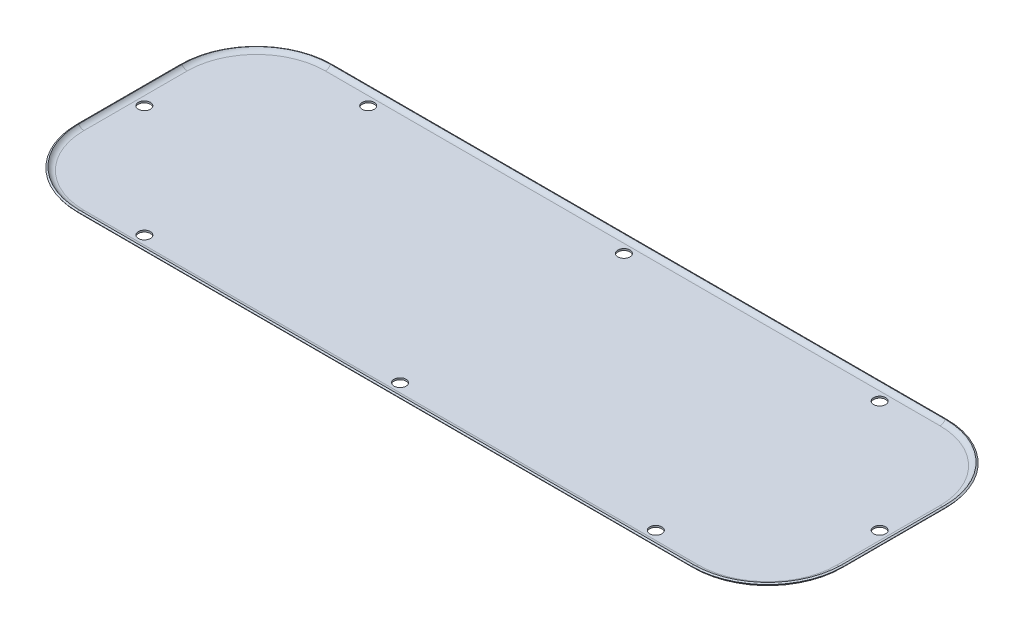
ISO-10303-21;
HEADER;
FILE_DESCRIPTION(('STEP AP214'),'2;1');
FILE_NAME('part.step','',(''),(''),'','','');
FILE_SCHEMA(('AUTOMOTIVE_DESIGN { 1 0 10303 214 1 1 1 1 }'));
ENDSEC;
DATA;
#1=APPLICATION_CONTEXT('core data for automotive mechanical design processes');
#2=APPLICATION_PROTOCOL_DEFINITION('international standard','automotive_design',2000,#1);
#3=PRODUCT_CONTEXT('',#1,'mechanical');
#4=PRODUCT('Part','Part','',(#3));
#5=PRODUCT_RELATED_PRODUCT_CATEGORY('part','',(#4));
#6=PRODUCT_DEFINITION_FORMATION('','',#4);
#7=PRODUCT_DEFINITION_CONTEXT('part definition',#1,'design');
#8=PRODUCT_DEFINITION('design','',#6,#7);
#9=PRODUCT_DEFINITION_SHAPE('','',#8);
#10=(LENGTH_UNIT() NAMED_UNIT(*) SI_UNIT(.MILLI.,.METRE.));
#11=(NAMED_UNIT(*) PLANE_ANGLE_UNIT() SI_UNIT($,.RADIAN.));
#12=(NAMED_UNIT(*) SI_UNIT($,.STERADIAN.) SOLID_ANGLE_UNIT());
#13=UNCERTAINTY_MEASURE_WITH_UNIT(LENGTH_MEASURE(1.E-05),#10,'distance_accuracy_value','');
#14=(GEOMETRIC_REPRESENTATION_CONTEXT(3) GLOBAL_UNCERTAINTY_ASSIGNED_CONTEXT((#13)) GLOBAL_UNIT_ASSIGNED_CONTEXT((#10,
#11,#12)) REPRESENTATION_CONTEXT('',''));
#15=CARTESIAN_POINT('',(0.,0.,0.));
#16=DIRECTION('',(0.,0.,1.));
#17=DIRECTION('',(1.,0.,0.));
#18=AXIS2_PLACEMENT_3D('',#15,#16,#17);
#19=CARTESIAN_POINT('',(-178.5,-396.5,119.));
#20=DIRECTION('',(0.,1.,0.));
#21=DIRECTION('',(1.,0.,0.));
#22=AXIS2_PLACEMENT_3D('',#19,#20,#21);
#23=TOROIDAL_SURFACE('',#22,40.07444271469,4.5);
#24=CARTESIAN_POINT('',(-178.5,-398.700000000004,119.));
#25=DIRECTION('',(0.,-1.,0.));
#26=DIRECTION('',(1.,0.,0.));
#27=AXIS2_PLACEMENT_3D('',#24,#25,#26);
#28=CIRCLE('',#27,43.999999999993);
#29=CARTESIAN_POINT('',(-222.499999999992,-398.699999999999,119.));
#30=VERTEX_POINT('',#29);
#31=CARTESIAN_POINT('',(-178.5,-398.700000000002,162.999999999996));
#32=VERTEX_POINT('',#31);
#33=EDGE_CURVE('E150',#30,#32,#28,.F.);
#34=ORIENTED_EDGE('',*,*,#33,.F.);
#35=CARTESIAN_POINT('',(-218.5744427147,-396.5,119.));
#36=DIRECTION('',(0.,0.,-1.));
#37=DIRECTION('',(-1.,0.,0.));
#38=AXIS2_PLACEMENT_3D('',#35,#36,#37);
#39=CIRCLE('',#38,4.5);
#40=CARTESIAN_POINT('',(-218.574442714699,-401.,119.));
#41=VERTEX_POINT('',#40);
#42=EDGE_CURVE('E130',#41,#30,#39,.T.);
#43=ORIENTED_EDGE('',*,*,#42,.F.);
#44=CARTESIAN_POINT('',(-178.5,-401.,119.));
#45=DIRECTION('',(0.,1.,0.));
#46=DIRECTION('',(-1.,0.,0.));
#47=AXIS2_PLACEMENT_3D('',#44,#45,#46);
#48=CIRCLE('',#47,40.074442714695);
#49=CARTESIAN_POINT('',(-178.5,-401.,159.074442714714));
#50=VERTEX_POINT('',#49);
#51=EDGE_CURVE('E270',#50,#41,#48,.F.);
#52=ORIENTED_EDGE('',*,*,#51,.F.);
#53=CARTESIAN_POINT('',(-178.5,-396.5,159.07444271472));
#54=DIRECTION('',(-1.,0.,0.));
#55=DIRECTION('',(0.,0.,1.));
#56=AXIS2_PLACEMENT_3D('',#53,#54,#55);
#57=CIRCLE('',#56,4.5);
#58=EDGE_CURVE('E153',#32,#50,#57,.F.);
#59=ORIENTED_EDGE('',*,*,#58,.F.);
#60=EDGE_LOOP('',(#34,#43,#52,#59));
#61=FACE_BOUND('',#60,.T.);
#62=ADVANCED_FACE('F16',(#61),#23,.T.);
#63=CARTESIAN_POINT('',(-218.5744427147,-396.5,57.8));
#64=DIRECTION('',(0.,0.,-1.));
#65=DIRECTION('',(-1.,0.,0.));
#66=AXIS2_PLACEMENT_3D('',#63,#64,#65);
#67=CYLINDRICAL_SURFACE('',#66,4.5);
#68=DIRECTION('',(0.,0.,1.));
#69=VECTOR('',#68,1.);
#70=CARTESIAN_POINT('',(-222.499999999993,-398.700000000004,89.));
#71=LINE('',#70,#69);
#72=CARTESIAN_POINT('',(-222.499999999996,-398.700000000003,59.));
#73=VERTEX_POINT('',#72);
#74=EDGE_CURVE('E134',#30,#73,#71,.F.);
#75=ORIENTED_EDGE('',*,*,#74,.T.);
#76=CARTESIAN_POINT('',(-218.57444271472,-396.5,59.));
#77=DIRECTION('',(0.,0.,1.));
#78=DIRECTION('',(-1.,0.,0.));
#79=AXIS2_PLACEMENT_3D('',#76,#77,#78);
#80=CIRCLE('',#79,4.5);
#81=CARTESIAN_POINT('',(-218.57444271471,-401.,59.));
#82=VERTEX_POINT('',#81);
#83=EDGE_CURVE('E140',#82,#73,#80,.F.);
#84=ORIENTED_EDGE('',*,*,#83,.F.);
#85=DIRECTION('',(0.,0.,-1.));
#86=VECTOR('',#85,1.);
#87=CARTESIAN_POINT('',(-218.5744427147,-401.,89.));
#88=LINE('',#87,#86);
#89=EDGE_CURVE('E136',#41,#82,#88,.T.);
#90=ORIENTED_EDGE('',*,*,#89,.F.);
#91=ORIENTED_EDGE('',*,*,#42,.T.);
#92=EDGE_LOOP('',(#75,#84,#90,#91));
#93=FACE_BOUND('',#92,.T.);
#94=ADVANCED_FACE('F132',(#93),#67,.T.);
#95=CARTESIAN_POINT('',(-178.5,-396.5,59.));
#96=DIRECTION('',(0.,1.,0.));
#97=DIRECTION('',(0.,0.,1.));
#98=AXIS2_PLACEMENT_3D('',#95,#96,#97);
#99=TOROIDAL_SURFACE('',#98,40.07444271472,4.5);
#100=CARTESIAN_POINT('',(-178.5,-398.700000000002,59.));
#101=DIRECTION('',(0.,-1.,0.));
#102=DIRECTION('',(0.,0.,1.));
#103=AXIS2_PLACEMENT_3D('',#100,#101,#102);
#104=CIRCLE('',#103,43.9999999999985);
#105=CARTESIAN_POINT('',(-178.5,-398.700000000001,15.0000000000013));
#106=VERTEX_POINT('',#105);
#107=EDGE_CURVE('E164',#106,#73,#104,.F.);
#108=ORIENTED_EDGE('',*,*,#107,.F.);
#109=CARTESIAN_POINT('',(-178.5,-396.5,18.92555728528));
#110=DIRECTION('',(1.,0.,0.));
#111=DIRECTION('',(0.,0.,-1.));
#112=AXIS2_PLACEMENT_3D('',#109,#110,#111);
#113=CIRCLE('',#112,4.5);
#114=CARTESIAN_POINT('',(-178.5,-401.,18.92555728528));
#115=VERTEX_POINT('',#114);
#116=EDGE_CURVE('E240',#115,#106,#113,.T.);
#117=ORIENTED_EDGE('',*,*,#116,.F.);
#118=CARTESIAN_POINT('',(-178.5,-401.,59.));
#119=DIRECTION('',(0.,1.,0.));
#120=DIRECTION('',(0.,0.,-1.));
#121=AXIS2_PLACEMENT_3D('',#118,#119,#120);
#122=CIRCLE('',#121,40.07444271472);
#123=EDGE_CURVE('E508',#82,#115,#122,.F.);
#124=ORIENTED_EDGE('',*,*,#123,.F.);
#125=ORIENTED_EDGE('',*,*,#83,.T.);
#126=EDGE_LOOP('',(#108,#117,#124,#125));
#127=FACE_BOUND('',#126,.T.);
#128=ADVANCED_FACE('F250',(#127),#99,.T.);
#129=CARTESIAN_POINT('',(185.64,-396.5,18.92555728528));
#130=DIRECTION('',(1.,0.,0.));
#131=DIRECTION('',(0.,0.,-1.));
#132=AXIS2_PLACEMENT_3D('',#129,#130,#131);
#133=CYLINDRICAL_SURFACE('',#132,4.5);
#134=DIRECTION('',(1.,0.,0.));
#135=VECTOR('',#134,1.);
#136=CARTESIAN_POINT('',(0.,-398.700000000002,15.0000000000014));
#137=LINE('',#136,#135);
#138=CARTESIAN_POINT('',(178.5,-398.699999999999,15.0000000000101));
#139=VERTEX_POINT('',#138);
#140=EDGE_CURVE('E300',#106,#139,#137,.T.);
#141=ORIENTED_EDGE('',*,*,#140,.T.);
#142=CARTESIAN_POINT('',(178.5,-396.5,18.92555728531));
#143=DIRECTION('',(-1.,0.,0.));
#144=DIRECTION('',(0.,0.,-1.));
#145=AXIS2_PLACEMENT_3D('',#142,#143,#144);
#146=CIRCLE('',#145,4.5);
#147=CARTESIAN_POINT('',(178.5,-401.,18.9255572852925));
#148=VERTEX_POINT('',#147);
#149=EDGE_CURVE('E217',#148,#139,#146,.F.);
#150=ORIENTED_EDGE('',*,*,#149,.F.);
#151=DIRECTION('',(1.,0.,0.));
#152=VECTOR('',#151,1.);
#153=CARTESIAN_POINT('',(0.,-401.,18.92555728528));
#154=LINE('',#153,#152);
#155=EDGE_CURVE('E506',#115,#148,#154,.T.);
#156=ORIENTED_EDGE('',*,*,#155,.F.);
#157=ORIENTED_EDGE('',*,*,#116,.T.);
#158=EDGE_LOOP('',(#141,#150,#156,#157));
#159=FACE_BOUND('',#158,.T.);
#160=ADVANCED_FACE('F228',(#159),#133,.T.);
#161=CARTESIAN_POINT('',(178.5,-396.5,59.));
#162=DIRECTION('',(0.,1.,0.));
#163=DIRECTION('',(-1.,0.,0.));
#164=AXIS2_PLACEMENT_3D('',#161,#162,#163);
#165=TOROIDAL_SURFACE('',#164,40.07444271469,4.5);
#166=CARTESIAN_POINT('',(178.5,-398.700000000003,59.));
#167=DIRECTION('',(0.,-1.,0.));
#168=DIRECTION('',(-1.,0.,0.));
#169=AXIS2_PLACEMENT_3D('',#166,#167,#168);
#170=CIRCLE('',#169,43.9999999999934);
#171=CARTESIAN_POINT('',(222.499999999992,-398.699999999998,59.));
#172=VERTEX_POINT('',#171);
#173=EDGE_CURVE('E292',#172,#139,#170,.F.);
#174=ORIENTED_EDGE('',*,*,#173,.F.);
#175=CARTESIAN_POINT('',(218.5744427147,-396.5,59.));
#176=DIRECTION('',(0.,0.,1.));
#177=DIRECTION('',(1.,0.,0.));
#178=AXIS2_PLACEMENT_3D('',#175,#176,#177);
#179=CIRCLE('',#178,4.5);
#180=CARTESIAN_POINT('',(218.574442714699,-401.,59.));
#181=VERTEX_POINT('',#180);
#182=EDGE_CURVE('E213',#181,#172,#179,.T.);
#183=ORIENTED_EDGE('',*,*,#182,.F.);
#184=CARTESIAN_POINT('',(178.5,-401.,59.));
#185=DIRECTION('',(0.,1.,0.));
#186=DIRECTION('',(1.,0.,0.));
#187=AXIS2_PLACEMENT_3D('',#184,#185,#186);
#188=CIRCLE('',#187,40.074442714695);
#189=EDGE_CURVE('E503',#148,#181,#188,.F.);
#190=ORIENTED_EDGE('',*,*,#189,.F.);
#191=ORIENTED_EDGE('',*,*,#149,.T.);
#192=EDGE_LOOP('',(#174,#183,#190,#191));
#193=FACE_BOUND('',#192,.T.);
#194=ADVANCED_FACE('F224',(#193),#165,.T.);
#195=CARTESIAN_POINT('',(218.5744427147,-396.5,120.2));
#196=DIRECTION('',(0.,0.,1.));
#197=DIRECTION('',(1.,0.,0.));
#198=AXIS2_PLACEMENT_3D('',#195,#196,#197);
#199=CYLINDRICAL_SURFACE('',#198,4.5);
#200=DIRECTION('',(0.,0.,1.));
#201=VECTOR('',#200,1.);
#202=CARTESIAN_POINT('',(222.499999999993,-398.700000000004,89.));
#203=LINE('',#202,#201);
#204=CARTESIAN_POINT('',(222.499999999997,-398.700000000003,119.));
#205=VERTEX_POINT('',#204);
#206=EDGE_CURVE('E288',#172,#205,#203,.T.);
#207=ORIENTED_EDGE('',*,*,#206,.T.);
#208=CARTESIAN_POINT('',(218.57444271472,-396.5,119.));
#209=DIRECTION('',(0.,0.,-1.));
#210=DIRECTION('',(1.,0.,0.));
#211=AXIS2_PLACEMENT_3D('',#208,#209,#210);
#212=CIRCLE('',#211,4.5);
#213=CARTESIAN_POINT('',(218.57444271471,-401.,119.));
#214=VERTEX_POINT('',#213);
#215=EDGE_CURVE('E183',#214,#205,#212,.F.);
#216=ORIENTED_EDGE('',*,*,#215,.F.);
#217=DIRECTION('',(0.,0.,-1.));
#218=VECTOR('',#217,1.);
#219=CARTESIAN_POINT('',(218.5744427147,-401.,89.));
#220=LINE('',#219,#218);
#221=EDGE_CURVE('E501',#181,#214,#220,.F.);
#222=ORIENTED_EDGE('',*,*,#221,.F.);
#223=ORIENTED_EDGE('',*,*,#182,.T.);
#224=EDGE_LOOP('',(#207,#216,#222,#223));
#225=FACE_BOUND('',#224,.T.);
#226=ADVANCED_FACE('F200',(#225),#199,.T.);
#227=CARTESIAN_POINT('',(178.5,-396.5,119.));
#228=DIRECTION('',(0.,1.,0.));
#229=DIRECTION('',(0.,0.,-1.));
#230=AXIS2_PLACEMENT_3D('',#227,#228,#229);
#231=TOROIDAL_SURFACE('',#230,40.07444271472,4.5);
#232=CARTESIAN_POINT('',(178.5,-398.700000000001,119.));
#233=DIRECTION('',(0.,-1.,0.));
#234=DIRECTION('',(0.,0.,-1.));
#235=AXIS2_PLACEMENT_3D('',#232,#233,#234);
#236=CIRCLE('',#235,43.9999999999998);
#237=CARTESIAN_POINT('',(178.5,-398.700000000001,162.999999999999));
#238=VERTEX_POINT('',#237);
#239=EDGE_CURVE('E282',#238,#205,#236,.F.);
#240=ORIENTED_EDGE('',*,*,#239,.F.);
#241=CARTESIAN_POINT('',(178.5,-396.5,159.07444271472));
#242=DIRECTION('',(-1.,0.,0.));
#243=DIRECTION('',(0.,0.,1.));
#244=AXIS2_PLACEMENT_3D('',#241,#242,#243);
#245=CIRCLE('',#244,4.5);
#246=CARTESIAN_POINT('',(178.5,-401.,159.07444271472));
#247=VERTEX_POINT('',#246);
#248=EDGE_CURVE('E181',#247,#238,#245,.T.);
#249=ORIENTED_EDGE('',*,*,#248,.F.);
#250=CARTESIAN_POINT('',(178.5,-401.,119.));
#251=DIRECTION('',(0.,1.,0.));
#252=DIRECTION('',(0.,0.,1.));
#253=AXIS2_PLACEMENT_3D('',#250,#251,#252);
#254=CIRCLE('',#253,40.07444271472);
#255=EDGE_CURVE('E488',#214,#247,#254,.F.);
#256=ORIENTED_EDGE('',*,*,#255,.F.);
#257=ORIENTED_EDGE('',*,*,#215,.T.);
#258=EDGE_LOOP('',(#240,#249,#256,#257));
#259=FACE_BOUND('',#258,.T.);
#260=ADVANCED_FACE('F194',(#259),#231,.T.);
#261=CARTESIAN_POINT('',(-185.64,-396.5,159.07444271472));
#262=DIRECTION('',(-1.,0.,0.));
#263=DIRECTION('',(0.,0.,1.));
#264=AXIS2_PLACEMENT_3D('',#261,#262,#263);
#265=CYLINDRICAL_SURFACE('',#264,4.5);
#266=DIRECTION('',(1.,0.,0.));
#267=VECTOR('',#266,1.);
#268=CARTESIAN_POINT('',(0.,-398.700000000002,162.999999999999));
#269=LINE('',#268,#267);
#270=EDGE_CURVE('E178',#238,#32,#269,.F.);
#271=ORIENTED_EDGE('',*,*,#270,.T.);
#272=ORIENTED_EDGE('',*,*,#58,.T.);
#273=DIRECTION('',(1.,0.,0.));
#274=VECTOR('',#273,1.);
#275=CARTESIAN_POINT('',(0.,-401.,159.07444271472));
#276=LINE('',#275,#274);
#277=EDGE_CURVE('E379',#247,#50,#276,.F.);
#278=ORIENTED_EDGE('',*,*,#277,.F.);
#279=ORIENTED_EDGE('',*,*,#248,.T.);
#280=EDGE_LOOP('',(#271,#272,#278,#279));
#281=FACE_BOUND('',#280,.T.);
#282=ADVANCED_FACE('F199',(#281),#265,.T.);
#283=CARTESIAN_POINT('',(0.,-398.455555555556,162.5638269683));
#284=DIRECTION('',(0.,-0.872346063394618,-0.48888888888981));
#285=DIRECTION('',(0.,0.48888888888981,-0.872346063394618));
#286=AXIS2_PLACEMENT_3D('',#283,#284,#285);
#287=PLANE('',#286);
#288=DIRECTION('',(-1.,0.,0.));
#289=VECTOR('',#288,1.);
#290=CARTESIAN_POINT('',(-185.64,-398.211111111112,162.127653936603));
#291=LINE('',#290,#289);
#292=CARTESIAN_POINT('',(178.5,-398.211111111112,162.127653936603));
#293=VERTEX_POINT('',#292);
#294=CARTESIAN_POINT('',(-178.5,-398.211111111103,162.127653936593));
#295=VERTEX_POINT('',#294);
#296=EDGE_CURVE('E376',#293,#295,#291,.T.);
#297=ORIENTED_EDGE('',*,*,#296,.T.);
#298=DIRECTION('',(0.,0.488888888897572,-0.872346063390268));
#299=VECTOR('',#298,1.);
#300=CARTESIAN_POINT('',(-178.5,-398.455555555556,162.5638269683));
#301=LINE('',#300,#299);
#302=EDGE_CURVE('E157',#32,#295,#301,.T.);
#303=ORIENTED_EDGE('',*,*,#302,.F.);
#304=ORIENTED_EDGE('',*,*,#270,.F.);
#305=DIRECTION('',(0.,0.488888888889955,-0.872346063394537));
#306=VECTOR('',#305,1.);
#307=CARTESIAN_POINT('',(178.5,-398.455555555555,162.5638269683));
#308=LINE('',#307,#306);
#309=EDGE_CURVE('E285',#293,#238,#308,.F.);
#310=ORIENTED_EDGE('',*,*,#309,.F.);
#311=EDGE_LOOP('',(#297,#303,#304,#310));
#312=FACE_BOUND('',#311,.T.);
#313=ADVANCED_FACE('F883',(#312),#287,.F.);
#314=CARTESIAN_POINT('',(-178.5,-398.700000000004,119.));
#315=DIRECTION('',(0.,-1.,0.));
#316=DIRECTION('',(0.,0.,-1.));
#317=AXIS2_PLACEMENT_3D('',#314,#315,#316);
#318=CONICAL_SURFACE('',#317,43.999999999993,1.05998073362512);
#319=DIRECTION('',(0.872346063390349,0.488888888897428,0.));
#320=VECTOR('',#319,1.);
#321=CARTESIAN_POINT('',(-222.0638269683,-398.455555555556,119.));
#322=LINE('',#321,#320);
#323=CARTESIAN_POINT('',(-221.627653936589,-398.211111111101,119.));
#324=VERTEX_POINT('',#323);
#325=EDGE_CURVE('E147',#324,#30,#322,.F.);
#326=ORIENTED_EDGE('',*,*,#325,.T.);
#327=ORIENTED_EDGE('',*,*,#33,.T.);
#328=ORIENTED_EDGE('',*,*,#302,.T.);
#329=CARTESIAN_POINT('',(-178.5,-398.211111111101,119.));
#330=DIRECTION('',(0.,1.,0.));
#331=DIRECTION('',(1.,0.,0.));
#332=AXIS2_PLACEMENT_3D('',#329,#330,#331);
#333=CIRCLE('',#332,43.1276539365888);
#334=EDGE_CURVE('E161',#295,#324,#333,.F.);
#335=ORIENTED_EDGE('',*,*,#334,.T.);
#336=EDGE_LOOP('',(#326,#327,#328,#335));
#337=FACE_BOUND('',#336,.T.);
#338=ADVANCED_FACE('F159',(#337),#318,.T.);
#339=CARTESIAN_POINT('',(-222.0638269683,-398.455555555556,89.));
#340=DIRECTION('',(0.488888888897428,-0.872346063390349,0.));
#341=DIRECTION('',(0.872346063390349,0.488888888897428,0.));
#342=AXIS2_PLACEMENT_3D('',#339,#340,#341);
#343=PLANE('',#342);
#344=DIRECTION('',(0.,0.,-1.));
#345=VECTOR('',#344,1.);
#346=CARTESIAN_POINT('',(-221.627653936588,-398.211111111102,57.8));
#347=LINE('',#346,#345);
#348=CARTESIAN_POINT('',(-221.627653936599,-398.21111111111,59.));
#349=VERTEX_POINT('',#348);
#350=EDGE_CURVE('E416',#324,#349,#347,.T.);
#351=ORIENTED_EDGE('',*,*,#350,.T.);
#352=DIRECTION('',(0.872346063394537,0.488888888889955,0.));
#353=VECTOR('',#352,1.);
#354=CARTESIAN_POINT('',(-222.0638269683,-398.455555555556,59.));
#355=LINE('',#354,#353);
#356=EDGE_CURVE('E149',#73,#349,#355,.T.);
#357=ORIENTED_EDGE('',*,*,#356,.F.);
#358=ORIENTED_EDGE('',*,*,#74,.F.);
#359=ORIENTED_EDGE('',*,*,#325,.F.);
#360=EDGE_LOOP('',(#351,#357,#358,#359));
#361=FACE_BOUND('',#360,.T.);
#362=ADVANCED_FACE('F145',(#361),#343,.F.);
#363=CARTESIAN_POINT('',(-178.5,-398.700000000002,59.));
#364=DIRECTION('',(0.,-1.,0.));
#365=DIRECTION('',(0.,0.,-1.));
#366=AXIS2_PLACEMENT_3D('',#363,#364,#365);
#367=CONICAL_SURFACE('',#366,43.9999999999986,1.05998073363383);
#368=DIRECTION('',(0.,-0.48888888888981,-0.872346063394618));
#369=VECTOR('',#368,1.);
#370=CARTESIAN_POINT('',(-178.5,-398.455555555556,15.4361730317));
#371=LINE('',#370,#369);
#372=CARTESIAN_POINT('',(-178.5,-398.211111111112,15.8723460633974));
#373=VERTEX_POINT('',#372);
#374=EDGE_CURVE('E303',#373,#106,#371,.T.);
#375=ORIENTED_EDGE('',*,*,#374,.T.);
#376=ORIENTED_EDGE('',*,*,#107,.T.);
#377=ORIENTED_EDGE('',*,*,#356,.T.);
#378=CARTESIAN_POINT('',(-178.5,-398.211111111113,59.));
#379=DIRECTION('',(0.,1.,0.));
#380=DIRECTION('',(0.,0.,1.));
#381=AXIS2_PLACEMENT_3D('',#378,#379,#380);
#382=CIRCLE('',#381,43.1276539366019);
#383=EDGE_CURVE('E409',#349,#373,#382,.F.);
#384=ORIENTED_EDGE('',*,*,#383,.T.);
#385=EDGE_LOOP('',(#375,#376,#377,#384));
#386=FACE_BOUND('',#385,.T.);
#387=ADVANCED_FACE('F859',(#386),#367,.T.);
#388=CARTESIAN_POINT('',(0.,-398.455555555556,15.4361730317));
#389=DIRECTION('',(0.,-0.872346063394618,0.48888888888981));
#390=DIRECTION('',(0.,-0.48888888888981,-0.872346063394618));
#391=AXIS2_PLACEMENT_3D('',#388,#389,#390);
#392=PLANE('',#391);
#393=DIRECTION('',(1.,0.,0.));
#394=VECTOR('',#393,1.);
#395=CARTESIAN_POINT('',(185.64,-398.211111111112,15.8723460633972));
#396=LINE('',#395,#394);
#397=CARTESIAN_POINT('',(178.5,-398.211111111103,15.8723460634074));
#398=VERTEX_POINT('',#397);
#399=EDGE_CURVE('E399',#373,#398,#396,.T.);
#400=ORIENTED_EDGE('',*,*,#399,.T.);
#401=DIRECTION('',(0.,0.488888888897572,0.872346063390268));
#402=VECTOR('',#401,1.);
#403=CARTESIAN_POINT('',(178.5,-398.455555555555,15.4361730317));
#404=LINE('',#403,#402);
#405=EDGE_CURVE('E297',#139,#398,#404,.T.);
#406=ORIENTED_EDGE('',*,*,#405,.F.);
#407=ORIENTED_EDGE('',*,*,#140,.F.);
#408=ORIENTED_EDGE('',*,*,#374,.F.);
#409=EDGE_LOOP('',(#400,#406,#407,#408));
#410=FACE_BOUND('',#409,.T.);
#411=ADVANCED_FACE('F850',(#410),#392,.F.);
#412=CARTESIAN_POINT('',(178.5,-398.700000000003,59.));
#413=DIRECTION('',(0.,-1.,0.));
#414=DIRECTION('',(0.,0.,-1.));
#415=AXIS2_PLACEMENT_3D('',#412,#413,#414);
#416=CONICAL_SURFACE('',#415,43.9999999999934,1.05998073362508);
#417=DIRECTION('',(0.872346063390373,-0.488888888897385,0.));
#418=VECTOR('',#417,1.);
#419=CARTESIAN_POINT('',(222.0638269683,-398.455555555556,59.));
#420=LINE('',#419,#418);
#421=CARTESIAN_POINT('',(221.627653936589,-398.211111111101,59.));
#422=VERTEX_POINT('',#421);
#423=EDGE_CURVE('E291',#422,#172,#420,.T.);
#424=ORIENTED_EDGE('',*,*,#423,.T.);
#425=ORIENTED_EDGE('',*,*,#173,.T.);
#426=ORIENTED_EDGE('',*,*,#405,.T.);
#427=CARTESIAN_POINT('',(178.5,-398.211111111101,59.));
#428=DIRECTION('',(0.,1.,0.));
#429=DIRECTION('',(-1.,0.,0.));
#430=AXIS2_PLACEMENT_3D('',#427,#428,#429);
#431=CIRCLE('',#430,43.1276539365888);
#432=EDGE_CURVE('E389',#398,#422,#431,.F.);
#433=ORIENTED_EDGE('',*,*,#432,.T.);
#434=EDGE_LOOP('',(#424,#425,#426,#433));
#435=FACE_BOUND('',#434,.T.);
#436=ADVANCED_FACE('F843',(#435),#416,.T.);
#437=CARTESIAN_POINT('',(222.0638269683,-398.455555555556,89.));
#438=DIRECTION('',(-0.488888888897385,-0.872346063390373,0.));
#439=DIRECTION('',(0.872346063390373,-0.488888888897385,0.));
#440=AXIS2_PLACEMENT_3D('',#437,#438,#439);
#441=PLANE('',#440);
#442=DIRECTION('',(0.,0.,1.));
#443=VECTOR('',#442,1.);
#444=CARTESIAN_POINT('',(221.627653936588,-398.211111111102,120.2));
#445=LINE('',#444,#443);
#446=CARTESIAN_POINT('',(221.627653936599,-398.21111111111,119.));
#447=VERTEX_POINT('',#446);
#448=EDGE_CURVE('E513',#422,#447,#445,.T.);
#449=ORIENTED_EDGE('',*,*,#448,.T.);
#450=DIRECTION('',(-0.872346063394537,0.488888888889955,0.));
#451=VECTOR('',#450,1.);
#452=CARTESIAN_POINT('',(222.0638269683,-398.455555555555,119.));
#453=LINE('',#452,#451);
#454=EDGE_CURVE('E372',#205,#447,#453,.T.);
#455=ORIENTED_EDGE('',*,*,#454,.F.);
#456=ORIENTED_EDGE('',*,*,#206,.F.);
#457=ORIENTED_EDGE('',*,*,#423,.F.);
#458=EDGE_LOOP('',(#449,#455,#456,#457));
#459=FACE_BOUND('',#458,.T.);
#460=ADVANCED_FACE('F836',(#459),#441,.F.);
#461=CARTESIAN_POINT('',(178.5,-398.700000000001,119.));
#462=DIRECTION('',(0.,-1.,0.));
#463=DIRECTION('',(0.,0.,-1.));
#464=AXIS2_PLACEMENT_3D('',#461,#462,#463);
#465=CONICAL_SURFACE('',#464,43.9999999999998,1.05998073363384);
#466=ORIENTED_EDGE('',*,*,#309,.T.);
#467=ORIENTED_EDGE('',*,*,#239,.T.);
#468=ORIENTED_EDGE('',*,*,#454,.T.);
#469=CARTESIAN_POINT('',(178.5,-398.211111111113,119.));
#470=DIRECTION('',(0.,1.,0.));
#471=DIRECTION('',(0.,0.,-1.));
#472=AXIS2_PLACEMENT_3D('',#469,#470,#471);
#473=CIRCLE('',#472,43.1276539366019);
#474=EDGE_CURVE('E357',#447,#293,#473,.F.);
#475=ORIENTED_EDGE('',*,*,#474,.T.);
#476=EDGE_LOOP('',(#466,#467,#468,#475));
#477=FACE_BOUND('',#476,.T.);
#478=ADVANCED_FACE('F470',(#477),#465,.T.);
#479=CARTESIAN_POINT('',(0.,-401.,89.));
#480=DIRECTION('',(0.,-1.,0.));
#481=DIRECTION('',(0.,0.,-1.));
#482=AXIS2_PLACEMENT_3D('',#479,#480,#481);
#483=PLANE('',#482);
#484=CARTESIAN_POINT('',(0.,-401.,154.));
#485=DIRECTION('',(0.,1.,0.));
#486=DIRECTION('',(0.,0.,1.));
#487=AXIS2_PLACEMENT_3D('',#484,#485,#486);
#488=CIRCLE('',#487,3.5);
#489=CARTESIAN_POINT('',(0.,-401.,157.5));
#490=VERTEX_POINT('',#489);
#491=EDGE_CURVE('E21',#490,#490,#488,.T.);
#492=ORIENTED_EDGE('',*,*,#491,.T.);
#493=EDGE_LOOP('',(#492));
#494=FACE_BOUND('',#493,.T.);
#495=CARTESIAN_POINT('',(0.,-401.,24.));
#496=DIRECTION('',(0.,1.,0.));
#497=DIRECTION('',(0.,0.,1.));
#498=AXIS2_PLACEMENT_3D('',#495,#496,#497);
#499=CIRCLE('',#498,3.5);
#500=CARTESIAN_POINT('',(0.,-401.,27.5));
#501=VERTEX_POINT('',#500);
#502=EDGE_CURVE('E352',#501,#501,#499,.T.);
#503=ORIENTED_EDGE('',*,*,#502,.T.);
#504=EDGE_LOOP('',(#503));
#505=FACE_BOUND('',#504,.T.);
#506=CARTESIAN_POINT('',(148.5,-401.,154.));
#507=DIRECTION('',(0.,1.,0.));
#508=DIRECTION('',(0.,0.,1.));
#509=AXIS2_PLACEMENT_3D('',#506,#507,#508);
#510=CIRCLE('',#509,3.5);
#511=CARTESIAN_POINT('',(148.5,-401.,157.5));
#512=VERTEX_POINT('',#511);
#513=EDGE_CURVE('E350',#512,#512,#510,.T.);
#514=ORIENTED_EDGE('',*,*,#513,.T.);
#515=EDGE_LOOP('',(#514));
#516=FACE_BOUND('',#515,.T.);
#517=CARTESIAN_POINT('',(148.5,-401.,24.));
#518=DIRECTION('',(0.,1.,0.));
#519=DIRECTION('',(0.,0.,1.));
#520=AXIS2_PLACEMENT_3D('',#517,#518,#519);
#521=CIRCLE('',#520,3.5);
#522=CARTESIAN_POINT('',(148.5,-401.,27.5));
#523=VERTEX_POINT('',#522);
#524=EDGE_CURVE('E347',#523,#523,#521,.T.);
#525=ORIENTED_EDGE('',*,*,#524,.T.);
#526=EDGE_LOOP('',(#525));
#527=FACE_BOUND('',#526,.T.);
#528=CARTESIAN_POINT('',(213.5,-401.,89.));
#529=DIRECTION('',(0.,1.,0.));
#530=DIRECTION('',(0.,0.,1.));
#531=AXIS2_PLACEMENT_3D('',#528,#529,#530);
#532=CIRCLE('',#531,3.5);
#533=CARTESIAN_POINT('',(213.5,-401.,92.5));
#534=VERTEX_POINT('',#533);
#535=EDGE_CURVE('E344',#534,#534,#532,.T.);
#536=ORIENTED_EDGE('',*,*,#535,.T.);
#537=EDGE_LOOP('',(#536));
#538=FACE_BOUND('',#537,.T.);
#539=CARTESIAN_POINT('',(-148.5,-401.,154.));
#540=DIRECTION('',(0.,1.,0.));
#541=DIRECTION('',(0.,0.,1.));
#542=AXIS2_PLACEMENT_3D('',#539,#540,#541);
#543=CIRCLE('',#542,3.5);
#544=CARTESIAN_POINT('',(-148.5,-401.,157.5));
#545=VERTEX_POINT('',#544);
#546=EDGE_CURVE('E341',#545,#545,#543,.T.);
#547=ORIENTED_EDGE('',*,*,#546,.T.);
#548=EDGE_LOOP('',(#547));
#549=FACE_BOUND('',#548,.T.);
#550=CARTESIAN_POINT('',(-148.5,-401.,24.));
#551=DIRECTION('',(0.,1.,0.));
#552=DIRECTION('',(0.,0.,1.));
#553=AXIS2_PLACEMENT_3D('',#550,#551,#552);
#554=CIRCLE('',#553,3.5);
#555=CARTESIAN_POINT('',(-148.5,-401.,27.5));
#556=VERTEX_POINT('',#555);
#557=EDGE_CURVE('E338',#556,#556,#554,.T.);
#558=ORIENTED_EDGE('',*,*,#557,.T.);
#559=EDGE_LOOP('',(#558));
#560=FACE_BOUND('',#559,.T.);
#561=CARTESIAN_POINT('',(-213.5,-401.,89.));
#562=DIRECTION('',(0.,1.,0.));
#563=DIRECTION('',(0.,0.,1.));
#564=AXIS2_PLACEMENT_3D('',#561,#562,#563);
#565=CIRCLE('',#564,3.5);
#566=CARTESIAN_POINT('',(-213.5,-401.,92.5));
#567=VERTEX_POINT('',#566);
#568=EDGE_CURVE('E334',#567,#567,#565,.T.);
#569=ORIENTED_EDGE('',*,*,#568,.T.);
#570=EDGE_LOOP('',(#569));
#571=FACE_BOUND('',#570,.T.);
#572=ORIENTED_EDGE('',*,*,#255,.T.);
#573=ORIENTED_EDGE('',*,*,#277,.T.);
#574=ORIENTED_EDGE('',*,*,#51,.T.);
#575=ORIENTED_EDGE('',*,*,#89,.T.);
#576=ORIENTED_EDGE('',*,*,#123,.T.);
#577=ORIENTED_EDGE('',*,*,#155,.T.);
#578=ORIENTED_EDGE('',*,*,#189,.T.);
#579=ORIENTED_EDGE('',*,*,#221,.T.);
#580=EDGE_LOOP('',(#572,#573,#574,#575,#576,#577,#578,#579));
#581=FACE_BOUND('',#580,.T.);
#582=ADVANCED_FACE('F461',(#494,#505,#516,#527,#538,#549,#560,#571,#581),#483,.T.);
#583=CARTESIAN_POINT('',(-185.64,-396.5,159.07444271472));
#584=DIRECTION('',(-1.,0.,0.));
#585=DIRECTION('',(0.,0.,1.));
#586=AXIS2_PLACEMENT_3D('',#583,#584,#585);
#587=CYLINDRICAL_SURFACE('',#586,3.5);
#588=CARTESIAN_POINT('',(178.5,-396.5,159.07444271472));
#589=DIRECTION('',(1.,0.,0.));
#590=DIRECTION('',(0.,0.,1.));
#591=AXIS2_PLACEMENT_3D('',#588,#589,#590);
#592=CIRCLE('',#591,3.5);
#593=CARTESIAN_POINT('',(178.5,-400.,159.07444271472));
#594=VERTEX_POINT('',#593);
#595=EDGE_CURVE('E364',#293,#594,#592,.T.);
#596=ORIENTED_EDGE('',*,*,#595,.T.);
#597=DIRECTION('',(1.,0.,0.));
#598=VECTOR('',#597,1.);
#599=CARTESIAN_POINT('',(0.,-400.,159.07444271472));
#600=LINE('',#599,#598);
#601=CARTESIAN_POINT('',(-178.5,-400.,159.07444271471));
#602=VERTEX_POINT('',#601);
#603=EDGE_CURVE('E337',#594,#602,#600,.F.);
#604=ORIENTED_EDGE('',*,*,#603,.T.);
#605=CARTESIAN_POINT('',(-178.5,-396.5,159.0744427147));
#606=DIRECTION('',(1.,0.,0.));
#607=DIRECTION('',(0.,0.,1.));
#608=AXIS2_PLACEMENT_3D('',#605,#606,#607);
#609=CIRCLE('',#608,3.5);
#610=EDGE_CURVE('E174',#602,#295,#609,.F.);
#611=ORIENTED_EDGE('',*,*,#610,.T.);
#612=ORIENTED_EDGE('',*,*,#296,.F.);
#613=EDGE_LOOP('',(#596,#604,#611,#612));
#614=FACE_BOUND('',#613,.T.);
#615=ADVANCED_FACE('F439',(#614),#587,.F.);
#616=CARTESIAN_POINT('',(-178.5,-396.5,119.));
#617=DIRECTION('',(0.,1.,0.));
#618=DIRECTION('',(1.,0.,0.));
#619=AXIS2_PLACEMENT_3D('',#616,#617,#618);
#620=TOROIDAL_SURFACE('',#619,40.0744427147,3.5);
#621=ORIENTED_EDGE('',*,*,#610,.F.);
#622=CARTESIAN_POINT('',(-178.5,-400.,119.));
#623=DIRECTION('',(0.,-1.,0.));
#624=DIRECTION('',(0.,0.,1.));
#625=AXIS2_PLACEMENT_3D('',#622,#623,#624);
#626=CIRCLE('',#625,40.0744427147);
#627=CARTESIAN_POINT('',(-218.5744427147,-400.,119.));
#628=VERTEX_POINT('',#627);
#629=EDGE_CURVE('E650',#602,#628,#626,.T.);
#630=ORIENTED_EDGE('',*,*,#629,.T.);
#631=CARTESIAN_POINT('',(-218.5744427147,-396.5,119.));
#632=DIRECTION('',(0.,0.,-1.));
#633=DIRECTION('',(-1.,0.,0.));
#634=AXIS2_PLACEMENT_3D('',#631,#632,#633);
#635=CIRCLE('',#634,3.5);
#636=EDGE_CURVE('E173',#628,#324,#635,.T.);
#637=ORIENTED_EDGE('',*,*,#636,.T.);
#638=ORIENTED_EDGE('',*,*,#334,.F.);
#639=EDGE_LOOP('',(#621,#630,#637,#638));
#640=FACE_BOUND('',#639,.T.);
#641=ADVANCED_FACE('F433',(#640),#620,.F.);
#642=CARTESIAN_POINT('',(-218.5744427147,-396.5,57.8));
#643=DIRECTION('',(0.,0.,-1.));
#644=DIRECTION('',(-1.,0.,0.));
#645=AXIS2_PLACEMENT_3D('',#642,#643,#644);
#646=CYLINDRICAL_SURFACE('',#645,3.5);
#647=ORIENTED_EDGE('',*,*,#636,.F.);
#648=DIRECTION('',(0.,0.,-1.));
#649=VECTOR('',#648,1.);
#650=CARTESIAN_POINT('',(-218.5744427147,-400.,89.));
#651=LINE('',#650,#649);
#652=CARTESIAN_POINT('',(-218.57444271471,-400.,59.));
#653=VERTEX_POINT('',#652);
#654=EDGE_CURVE('E647',#628,#653,#651,.T.);
#655=ORIENTED_EDGE('',*,*,#654,.T.);
#656=CARTESIAN_POINT('',(-218.57444271472,-396.5,59.));
#657=DIRECTION('',(0.,0.,1.));
#658=DIRECTION('',(-1.,0.,0.));
#659=AXIS2_PLACEMENT_3D('',#656,#657,#658);
#660=CIRCLE('',#659,3.5);
#661=EDGE_CURVE('E412',#653,#349,#660,.F.);
#662=ORIENTED_EDGE('',*,*,#661,.T.);
#663=ORIENTED_EDGE('',*,*,#350,.F.);
#664=EDGE_LOOP('',(#647,#655,#662,#663));
#665=FACE_BOUND('',#664,.T.);
#666=ADVANCED_FACE('F438',(#665),#646,.F.);
#667=CARTESIAN_POINT('',(-178.5,-396.5,59.));
#668=DIRECTION('',(0.,1.,0.));
#669=DIRECTION('',(0.,0.,1.));
#670=AXIS2_PLACEMENT_3D('',#667,#668,#669);
#671=TOROIDAL_SURFACE('',#670,40.07444271472,3.5);
#672=ORIENTED_EDGE('',*,*,#661,.F.);
#673=CARTESIAN_POINT('',(-178.5,-400.,59.));
#674=DIRECTION('',(0.,-1.,0.));
#675=DIRECTION('',(-1.,0.,0.));
#676=AXIS2_PLACEMENT_3D('',#673,#674,#675);
#677=CIRCLE('',#676,40.07444271472);
#678=CARTESIAN_POINT('',(-178.5,-400.,18.92555728528));
#679=VERTEX_POINT('',#678);
#680=EDGE_CURVE('E644',#653,#679,#677,.T.);
#681=ORIENTED_EDGE('',*,*,#680,.T.);
#682=CARTESIAN_POINT('',(-178.5,-396.5,18.92555728528));
#683=DIRECTION('',(1.,0.,0.));
#684=DIRECTION('',(0.,0.,-1.));
#685=AXIS2_PLACEMENT_3D('',#682,#683,#684);
#686=CIRCLE('',#685,3.5);
#687=EDGE_CURVE('E402',#679,#373,#686,.T.);
#688=ORIENTED_EDGE('',*,*,#687,.T.);
#689=ORIENTED_EDGE('',*,*,#383,.F.);
#690=EDGE_LOOP('',(#672,#681,#688,#689));
#691=FACE_BOUND('',#690,.T.);
#692=ADVANCED_FACE('F562',(#691),#671,.F.);
#693=CARTESIAN_POINT('',(185.64,-396.5,18.92555728528));
#694=DIRECTION('',(1.,0.,0.));
#695=DIRECTION('',(0.,0.,-1.));
#696=AXIS2_PLACEMENT_3D('',#693,#694,#695);
#697=CYLINDRICAL_SURFACE('',#696,3.5);
#698=ORIENTED_EDGE('',*,*,#687,.F.);
#699=DIRECTION('',(1.,0.,0.));
#700=VECTOR('',#699,1.);
#701=CARTESIAN_POINT('',(0.,-400.,18.92555728528));
#702=LINE('',#701,#700);
#703=CARTESIAN_POINT('',(178.5,-400.,18.92555728529));
#704=VERTEX_POINT('',#703);
#705=EDGE_CURVE('E639',#679,#704,#702,.T.);
#706=ORIENTED_EDGE('',*,*,#705,.T.);
#707=CARTESIAN_POINT('',(178.5,-396.5,18.9255572853));
#708=DIRECTION('',(-1.,0.,0.));
#709=DIRECTION('',(0.,0.,-1.));
#710=AXIS2_PLACEMENT_3D('',#707,#708,#709);
#711=CIRCLE('',#710,3.5);
#712=EDGE_CURVE('E393',#704,#398,#711,.F.);
#713=ORIENTED_EDGE('',*,*,#712,.T.);
#714=ORIENTED_EDGE('',*,*,#399,.F.);
#715=EDGE_LOOP('',(#698,#706,#713,#714));
#716=FACE_BOUND('',#715,.T.);
#717=ADVANCED_FACE('F540',(#716),#697,.F.);
#718=CARTESIAN_POINT('',(178.5,-396.5,59.));
#719=DIRECTION('',(0.,1.,0.));
#720=DIRECTION('',(-1.,0.,0.));
#721=AXIS2_PLACEMENT_3D('',#718,#719,#720);
#722=TOROIDAL_SURFACE('',#721,40.0744427147,3.5);
#723=ORIENTED_EDGE('',*,*,#712,.F.);
#724=CARTESIAN_POINT('',(178.5,-400.,59.));
#725=DIRECTION('',(0.,-1.,0.));
#726=DIRECTION('',(0.,0.,-1.));
#727=AXIS2_PLACEMENT_3D('',#724,#725,#726);
#728=CIRCLE('',#727,40.0744427147);
#729=CARTESIAN_POINT('',(218.5744427147,-400.,59.));
#730=VERTEX_POINT('',#729);
#731=EDGE_CURVE('E623',#704,#730,#728,.T.);
#732=ORIENTED_EDGE('',*,*,#731,.T.);
#733=CARTESIAN_POINT('',(218.5744427147,-396.5,59.));
#734=DIRECTION('',(0.,0.,1.));
#735=DIRECTION('',(1.,0.,0.));
#736=AXIS2_PLACEMENT_3D('',#733,#734,#735);
#737=CIRCLE('',#736,3.5);
#738=EDGE_CURVE('E392',#730,#422,#737,.T.);
#739=ORIENTED_EDGE('',*,*,#738,.T.);
#740=ORIENTED_EDGE('',*,*,#432,.F.);
#741=EDGE_LOOP('',(#723,#732,#739,#740));
#742=FACE_BOUND('',#741,.T.);
#743=ADVANCED_FACE('F534',(#742),#722,.F.);
#744=CARTESIAN_POINT('',(218.5744427147,-396.5,120.2));
#745=DIRECTION('',(0.,0.,1.));
#746=DIRECTION('',(1.,0.,0.));
#747=AXIS2_PLACEMENT_3D('',#744,#745,#746);
#748=CYLINDRICAL_SURFACE('',#747,3.5);
#749=ORIENTED_EDGE('',*,*,#738,.F.);
#750=DIRECTION('',(0.,0.,-1.));
#751=VECTOR('',#750,1.);
#752=CARTESIAN_POINT('',(218.5744427147,-400.,89.));
#753=LINE('',#752,#751);
#754=CARTESIAN_POINT('',(218.57444271471,-400.,119.));
#755=VERTEX_POINT('',#754);
#756=EDGE_CURVE('E633',#730,#755,#753,.F.);
#757=ORIENTED_EDGE('',*,*,#756,.T.);
#758=CARTESIAN_POINT('',(218.57444271472,-396.5,119.));
#759=DIRECTION('',(0.,0.,-1.));
#760=DIRECTION('',(1.,0.,0.));
#761=AXIS2_PLACEMENT_3D('',#758,#759,#760);
#762=CIRCLE('',#761,3.5);
#763=EDGE_CURVE('E36',#755,#447,#762,.F.);
#764=ORIENTED_EDGE('',*,*,#763,.T.);
#765=ORIENTED_EDGE('',*,*,#448,.F.);
#766=EDGE_LOOP('',(#749,#757,#764,#765));
#767=FACE_BOUND('',#766,.T.);
#768=ADVANCED_FACE('F539',(#767),#748,.F.);
#769=CARTESIAN_POINT('',(178.5,-396.5,119.));
#770=DIRECTION('',(0.,1.,0.));
#771=DIRECTION('',(0.,0.,-1.));
#772=AXIS2_PLACEMENT_3D('',#769,#770,#771);
#773=TOROIDAL_SURFACE('',#772,40.07444271472,3.5);
#774=ORIENTED_EDGE('',*,*,#763,.F.);
#775=CARTESIAN_POINT('',(178.5,-400.,119.));
#776=DIRECTION('',(0.,-1.,0.));
#777=DIRECTION('',(1.,0.,0.));
#778=AXIS2_PLACEMENT_3D('',#775,#776,#777);
#779=CIRCLE('',#778,40.07444271472);
#780=EDGE_CURVE('E333',#755,#594,#779,.T.);
#781=ORIENTED_EDGE('',*,*,#780,.T.);
#782=ORIENTED_EDGE('',*,*,#595,.F.);
#783=ORIENTED_EDGE('',*,*,#474,.F.);
#784=EDGE_LOOP('',(#774,#781,#782,#783));
#785=FACE_BOUND('',#784,.T.);
#786=ADVANCED_FACE('F658',(#785),#773,.F.);
#787=CARTESIAN_POINT('',(0.,-399.380965033621,154.));
#788=DIRECTION('',(0.,1.,0.));
#789=DIRECTION('',(0.,0.,1.));
#790=AXIS2_PLACEMENT_3D('',#787,#788,#789);
#791=CYLINDRICAL_SURFACE('',#790,3.5);
#792=CARTESIAN_POINT('',(0.,-400.,154.));
#793=DIRECTION('',(0.,1.,0.));
#794=DIRECTION('',(0.,0.,1.));
#795=AXIS2_PLACEMENT_3D('',#792,#793,#794);
#796=CIRCLE('',#795,3.5);
#797=CARTESIAN_POINT('',(0.,-400.,157.5));
#798=VERTEX_POINT('',#797);
#799=EDGE_CURVE('E330',#798,#798,#796,.T.);
#800=ORIENTED_EDGE('',*,*,#799,.T.);
#801=EDGE_LOOP('',(#800));
#802=FACE_BOUND('',#801,.T.);
#803=ORIENTED_EDGE('',*,*,#491,.F.);
#804=EDGE_LOOP('',(#803));
#805=FACE_BOUND('',#804,.T.);
#806=ADVANCED_FACE('F662',(#802,#805),#791,.F.);
#807=CARTESIAN_POINT('',(0.,-399.380965033621,24.));
#808=DIRECTION('',(0.,1.,0.));
#809=DIRECTION('',(0.,0.,1.));
#810=AXIS2_PLACEMENT_3D('',#807,#808,#809);
#811=CYLINDRICAL_SURFACE('',#810,3.5);
#812=CARTESIAN_POINT('',(0.,-400.,24.));
#813=DIRECTION('',(0.,1.,0.));
#814=DIRECTION('',(0.,0.,1.));
#815=AXIS2_PLACEMENT_3D('',#812,#813,#814);
#816=CIRCLE('',#815,3.5);
#817=CARTESIAN_POINT('',(0.,-400.,27.5));
#818=VERTEX_POINT('',#817);
#819=EDGE_CURVE('E327',#818,#818,#816,.T.);
#820=ORIENTED_EDGE('',*,*,#819,.T.);
#821=EDGE_LOOP('',(#820));
#822=FACE_BOUND('',#821,.T.);
#823=ORIENTED_EDGE('',*,*,#502,.F.);
#824=EDGE_LOOP('',(#823));
#825=FACE_BOUND('',#824,.T.);
#826=ADVANCED_FACE('F674',(#822,#825),#811,.F.);
#827=CARTESIAN_POINT('',(148.5,-399.380965033621,154.));
#828=DIRECTION('',(0.,1.,0.));
#829=DIRECTION('',(0.,0.,1.));
#830=AXIS2_PLACEMENT_3D('',#827,#828,#829);
#831=CYLINDRICAL_SURFACE('',#830,3.5);
#832=CARTESIAN_POINT('',(148.5,-400.,154.));
#833=DIRECTION('',(0.,1.,0.));
#834=DIRECTION('',(0.,0.,1.));
#835=AXIS2_PLACEMENT_3D('',#832,#833,#834);
#836=CIRCLE('',#835,3.5);
#837=CARTESIAN_POINT('',(148.5,-400.,157.5));
#838=VERTEX_POINT('',#837);
#839=EDGE_CURVE('E324',#838,#838,#836,.T.);
#840=ORIENTED_EDGE('',*,*,#839,.T.);
#841=EDGE_LOOP('',(#840));
#842=FACE_BOUND('',#841,.T.);
#843=ORIENTED_EDGE('',*,*,#513,.F.);
#844=EDGE_LOOP('',(#843));
#845=FACE_BOUND('',#844,.T.);
#846=ADVANCED_FACE('F678',(#842,#845),#831,.F.);
#847=CARTESIAN_POINT('',(148.5,-399.380965033621,24.));
#848=DIRECTION('',(0.,1.,0.));
#849=DIRECTION('',(0.,0.,1.));
#850=AXIS2_PLACEMENT_3D('',#847,#848,#849);
#851=CYLINDRICAL_SURFACE('',#850,3.5);
#852=CARTESIAN_POINT('',(148.5,-400.,24.));
#853=DIRECTION('',(0.,1.,0.));
#854=DIRECTION('',(0.,0.,1.));
#855=AXIS2_PLACEMENT_3D('',#852,#853,#854);
#856=CIRCLE('',#855,3.5);
#857=CARTESIAN_POINT('',(148.5,-400.,27.5));
#858=VERTEX_POINT('',#857);
#859=EDGE_CURVE('E321',#858,#858,#856,.T.);
#860=ORIENTED_EDGE('',*,*,#859,.T.);
#861=EDGE_LOOP('',(#860));
#862=FACE_BOUND('',#861,.T.);
#863=ORIENTED_EDGE('',*,*,#524,.F.);
#864=EDGE_LOOP('',(#863));
#865=FACE_BOUND('',#864,.T.);
#866=ADVANCED_FACE('F682',(#862,#865),#851,.F.);
#867=CARTESIAN_POINT('',(213.5,-399.380965033621,89.));
#868=DIRECTION('',(0.,1.,0.));
#869=DIRECTION('',(0.,0.,1.));
#870=AXIS2_PLACEMENT_3D('',#867,#868,#869);
#871=CYLINDRICAL_SURFACE('',#870,3.5);
#872=CARTESIAN_POINT('',(213.5,-400.,89.));
#873=DIRECTION('',(0.,1.,0.));
#874=DIRECTION('',(0.,0.,1.));
#875=AXIS2_PLACEMENT_3D('',#872,#873,#874);
#876=CIRCLE('',#875,3.5);
#877=CARTESIAN_POINT('',(213.5,-400.,92.5));
#878=VERTEX_POINT('',#877);
#879=EDGE_CURVE('E318',#878,#878,#876,.T.);
#880=ORIENTED_EDGE('',*,*,#879,.T.);
#881=EDGE_LOOP('',(#880));
#882=FACE_BOUND('',#881,.T.);
#883=ORIENTED_EDGE('',*,*,#535,.F.);
#884=EDGE_LOOP('',(#883));
#885=FACE_BOUND('',#884,.T.);
#886=ADVANCED_FACE('F686',(#882,#885),#871,.F.);
#887=CARTESIAN_POINT('',(-148.5,-399.380965033621,154.));
#888=DIRECTION('',(0.,1.,0.));
#889=DIRECTION('',(0.,0.,1.));
#890=AXIS2_PLACEMENT_3D('',#887,#888,#889);
#891=CYLINDRICAL_SURFACE('',#890,3.5);
#892=CARTESIAN_POINT('',(-148.5,-400.,154.));
#893=DIRECTION('',(0.,1.,0.));
#894=DIRECTION('',(0.,0.,1.));
#895=AXIS2_PLACEMENT_3D('',#892,#893,#894);
#896=CIRCLE('',#895,3.5);
#897=CARTESIAN_POINT('',(-148.5,-400.,157.5));
#898=VERTEX_POINT('',#897);
#899=EDGE_CURVE('E315',#898,#898,#896,.T.);
#900=ORIENTED_EDGE('',*,*,#899,.T.);
#901=EDGE_LOOP('',(#900));
#902=FACE_BOUND('',#901,.T.);
#903=ORIENTED_EDGE('',*,*,#546,.F.);
#904=EDGE_LOOP('',(#903));
#905=FACE_BOUND('',#904,.T.);
#906=ADVANCED_FACE('F690',(#902,#905),#891,.F.);
#907=CARTESIAN_POINT('',(-148.5,-399.380965033621,24.));
#908=DIRECTION('',(0.,1.,0.));
#909=DIRECTION('',(0.,0.,1.));
#910=AXIS2_PLACEMENT_3D('',#907,#908,#909);
#911=CYLINDRICAL_SURFACE('',#910,3.5);
#912=CARTESIAN_POINT('',(-148.5,-400.,24.));
#913=DIRECTION('',(0.,1.,0.));
#914=DIRECTION('',(0.,0.,1.));
#915=AXIS2_PLACEMENT_3D('',#912,#913,#914);
#916=CIRCLE('',#915,3.5);
#917=CARTESIAN_POINT('',(-148.5,-400.,27.5));
#918=VERTEX_POINT('',#917);
#919=EDGE_CURVE('E27',#918,#918,#916,.T.);
#920=ORIENTED_EDGE('',*,*,#919,.T.);
#921=EDGE_LOOP('',(#920));
#922=FACE_BOUND('',#921,.T.);
#923=ORIENTED_EDGE('',*,*,#557,.F.);
#924=EDGE_LOOP('',(#923));
#925=FACE_BOUND('',#924,.T.);
#926=ADVANCED_FACE('F588',(#922,#925),#911,.F.);
#927=CARTESIAN_POINT('',(-213.5,-399.380965033621,89.));
#928=DIRECTION('',(0.,1.,0.));
#929=DIRECTION('',(0.,0.,1.));
#930=AXIS2_PLACEMENT_3D('',#927,#928,#929);
#931=CYLINDRICAL_SURFACE('',#930,3.5);
#932=CARTESIAN_POINT('',(-213.5,-400.,89.));
#933=DIRECTION('',(0.,1.,0.));
#934=DIRECTION('',(0.,0.,1.));
#935=AXIS2_PLACEMENT_3D('',#932,#933,#934);
#936=CIRCLE('',#935,3.5);
#937=CARTESIAN_POINT('',(-213.5,-400.,92.5));
#938=VERTEX_POINT('',#937);
#939=EDGE_CURVE('E11',#938,#938,#936,.T.);
#940=ORIENTED_EDGE('',*,*,#939,.T.);
#941=EDGE_LOOP('',(#940));
#942=FACE_BOUND('',#941,.T.);
#943=ORIENTED_EDGE('',*,*,#568,.F.);
#944=EDGE_LOOP('',(#943));
#945=FACE_BOUND('',#944,.T.);
#946=ADVANCED_FACE('F582',(#942,#945),#931,.F.);
#947=CARTESIAN_POINT('',(0.,-400.,89.));
#948=DIRECTION('',(0.,-1.,0.));
#949=DIRECTION('',(0.,0.,-1.));
#950=AXIS2_PLACEMENT_3D('',#947,#948,#949);
#951=PLANE('',#950);
#952=ORIENTED_EDGE('',*,*,#939,.F.);
#953=EDGE_LOOP('',(#952));
#954=FACE_BOUND('',#953,.T.);
#955=ORIENTED_EDGE('',*,*,#919,.F.);
#956=EDGE_LOOP('',(#955));
#957=FACE_BOUND('',#956,.T.);
#958=ORIENTED_EDGE('',*,*,#899,.F.);
#959=EDGE_LOOP('',(#958));
#960=FACE_BOUND('',#959,.T.);
#961=ORIENTED_EDGE('',*,*,#879,.F.);
#962=EDGE_LOOP('',(#961));
#963=FACE_BOUND('',#962,.T.);
#964=ORIENTED_EDGE('',*,*,#859,.F.);
#965=EDGE_LOOP('',(#964));
#966=FACE_BOUND('',#965,.T.);
#967=ORIENTED_EDGE('',*,*,#839,.F.);
#968=EDGE_LOOP('',(#967));
#969=FACE_BOUND('',#968,.T.);
#970=ORIENTED_EDGE('',*,*,#819,.F.);
#971=EDGE_LOOP('',(#970));
#972=FACE_BOUND('',#971,.T.);
#973=ORIENTED_EDGE('',*,*,#799,.F.);
#974=EDGE_LOOP('',(#973));
#975=FACE_BOUND('',#974,.T.);
#976=ORIENTED_EDGE('',*,*,#756,.F.);
#977=ORIENTED_EDGE('',*,*,#731,.F.);
#978=ORIENTED_EDGE('',*,*,#705,.F.);
#979=ORIENTED_EDGE('',*,*,#680,.F.);
#980=ORIENTED_EDGE('',*,*,#654,.F.);
#981=ORIENTED_EDGE('',*,*,#629,.F.);
#982=ORIENTED_EDGE('',*,*,#603,.F.);
#983=ORIENTED_EDGE('',*,*,#780,.F.);
#984=EDGE_LOOP('',(#976,#977,#978,#979,#980,#981,#982,#983));
#985=FACE_BOUND('',#984,.T.);
#986=ADVANCED_FACE('F580',(#954,#957,#960,#963,#966,#969,#972,#975,#985),#951,.F.);
#987=CLOSED_SHELL('',(#62,#94,#128,#160,#194,#226,#260,#282,#313,#338,#362,#387,#411,#436,#460,
#478,#582,#615,#641,#666,#692,#717,#743,#768,#786,#806,#826,#846,#866,#886,#906,#926,#946,#986));
#988=MANIFOLD_SOLID_BREP('B1',#987);
#989=ADVANCED_BREP_SHAPE_REPRESENTATION('',(#18,#988),#14);
#990=SHAPE_DEFINITION_REPRESENTATION(#9,#989);
ENDSEC;
END-ISO-10303-21;
